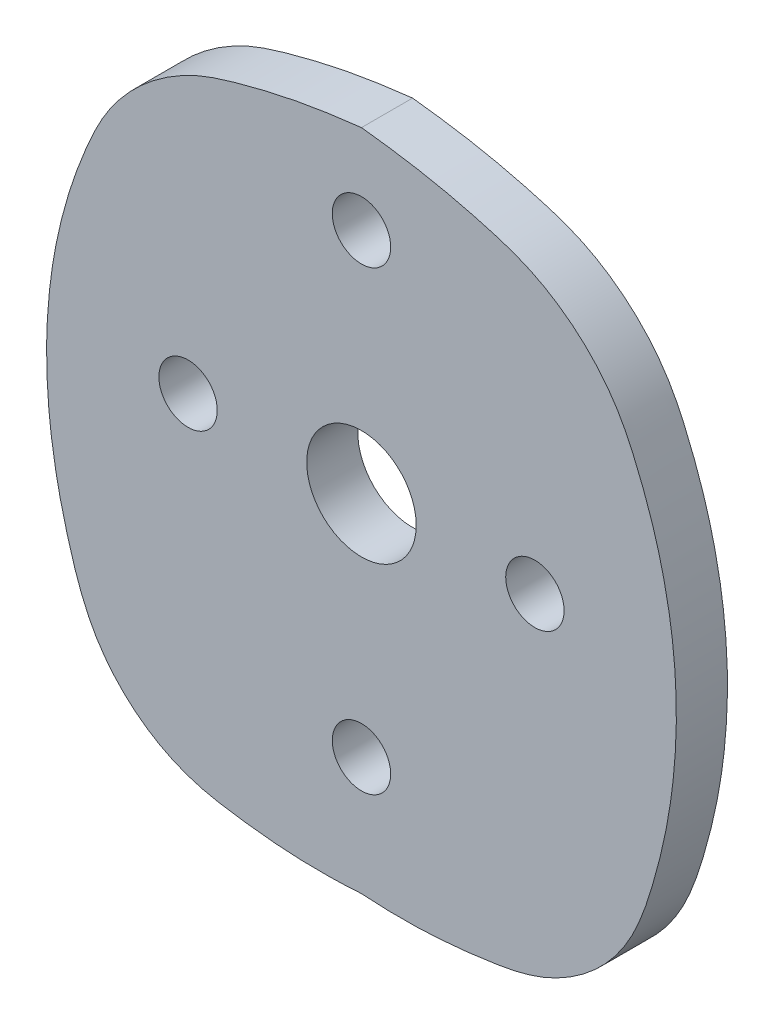
ISO-10303-21;
HEADER;
FILE_DESCRIPTION(('STEP AP214'),'2;1');
FILE_NAME('part.step','',(''),(''),'','','');
FILE_SCHEMA(('AUTOMOTIVE_DESIGN { 1 0 10303 214 1 1 1 1 }'));
ENDSEC;
DATA;
#1=APPLICATION_CONTEXT('core data for automotive mechanical design processes');
#2=APPLICATION_PROTOCOL_DEFINITION('international standard','automotive_design',2000,#1);
#3=PRODUCT_CONTEXT('',#1,'mechanical');
#4=PRODUCT('Part','Part','',(#3));
#5=PRODUCT_RELATED_PRODUCT_CATEGORY('part','',(#4));
#6=PRODUCT_DEFINITION_FORMATION('','',#4);
#7=PRODUCT_DEFINITION_CONTEXT('part definition',#1,'design');
#8=PRODUCT_DEFINITION('design','',#6,#7);
#9=PRODUCT_DEFINITION_SHAPE('','',#8);
#10=(LENGTH_UNIT() NAMED_UNIT(*) SI_UNIT(.MILLI.,.METRE.));
#11=(NAMED_UNIT(*) PLANE_ANGLE_UNIT() SI_UNIT($,.RADIAN.));
#12=(NAMED_UNIT(*) SI_UNIT($,.STERADIAN.) SOLID_ANGLE_UNIT());
#13=UNCERTAINTY_MEASURE_WITH_UNIT(LENGTH_MEASURE(1.E-05),#10,'distance_accuracy_value','');
#14=(GEOMETRIC_REPRESENTATION_CONTEXT(3) GLOBAL_UNCERTAINTY_ASSIGNED_CONTEXT((#13)) GLOBAL_UNIT_ASSIGNED_CONTEXT((#10,
#11,#12)) REPRESENTATION_CONTEXT('',''));
#15=CARTESIAN_POINT('',(0.,0.,0.));
#16=DIRECTION('',(0.,0.,1.));
#17=DIRECTION('',(1.,0.,0.));
#18=AXIS2_PLACEMENT_3D('',#15,#16,#17);
#19=CARTESIAN_POINT('',(17.2495468003958,102.153971763052,1.4));
#20=DIRECTION('',(0.,0.,-1.));
#21=DIRECTION('',(-1.,0.,0.));
#22=AXIS2_PLACEMENT_3D('',#19,#20,#21);
#23=PLANE('',#22);
#24=CARTESIAN_POINT('',(-0.00194851605084502,84.6627538818189,1.4));
#25=CARTESIAN_POINT('',(1.18640589704128,84.5749137239421,1.4));
#26=CARTESIAN_POINT('',(2.98152019668558,84.5534099120876,1.4));
#27=CARTESIAN_POINT('',(5.35288257603574,84.7299636902166,1.4));
#28=CARTESIAN_POINT('',(6.82893385604703,84.9200075591356,1.4));
#29=CARTESIAN_POINT('',(7.99248681931417,85.1043236099056,1.4));
#30=CARTESIAN_POINT('',(9.23385005522742,85.3782819656437,1.4));
#31=CARTESIAN_POINT('',(11.3097733927601,86.1719660445361,1.4));
#32=CARTESIAN_POINT('',(13.3512037583954,87.7914583641674,1.4));
#33=CARTESIAN_POINT('',(14.78394244169,89.883427402172,1.4));
#34=CARTESIAN_POINT('',(15.526120315298,91.6368959522322,1.4));
#35=CARTESIAN_POINT('',(16.0394099126427,93.3206564434219,1.4));
#36=CARTESIAN_POINT('',(16.6460931162424,95.6300295512059,1.4));
#37=CARTESIAN_POINT('',(17.1455982132386,98.5678877874798,1.4));
#38=CARTESIAN_POINT('',(17.3265839530986,102.154340228356,1.4));
#39=CARTESIAN_POINT('',(17.0453467767421,105.738581877409,1.4));
#40=CARTESIAN_POINT('',(16.4231764952126,108.669286983542,1.4));
#41=CARTESIAN_POINT('',(15.7006454750322,110.94782369539,1.4));
#42=CARTESIAN_POINT('',(15.1552395286702,112.341634893575,1.4));
#43=CARTESIAN_POINT('',(14.6797913683984,113.427246380424,1.4));
#44=CARTESIAN_POINT('',(14.1108342562074,114.550989632922,1.4));
#45=CARTESIAN_POINT('',(12.8669354376532,116.35778972915,1.4));
#46=CARTESIAN_POINT('',(10.9468766202507,118.02057598982,1.4));
#47=CARTESIAN_POINT('',(8.70699948376297,119.152590801809,1.4));
#48=CARTESIAN_POINT('',(6.94701455866536,119.693958367133,1.4));
#49=CARTESIAN_POINT('',(5.2464996036479,120.138050756151,1.4));
#50=CARTESIAN_POINT('',(2.92064138135333,120.635596611244,1.4));
#51=CARTESIAN_POINT('',(1.17271692036244,120.875374778235,1.4));
#52=CARTESIAN_POINT('',(0.00112271873752491,121.010798341713,1.4));
#53=B_SPLINE_CURVE_WITH_KNOTS('',3,(#24,#25,#26,#27,#28,#29,#30,#31,#32,#33,#34,#35,#36,#37,#38,
#39,#40,#41,#42,#43,#44,#45,#46,#47,#48,#49,#50,#51,#52),.UNSPECIFIED.,.F.,.F.,(4,1,1,1,1,1,1,1,
1,1,1,1,1,1,1,1,1,1,1,1,1,1,1,1,1,1,4),(0.0010272292882612,0.0635655807344601,
0.0948347564575595,0.126103932180659,0.141738520042209,0.157373107903758,0.188642283626858,
0.251180635073057,0.282449810796156,0.313718986519256,0.344988162242355,0.376257337965454,
0.438795689411653,0.501334040857852,0.563872392304051,0.62641074375025,0.657679919473349,
0.688949095196449,0.704583683057999,0.720218270919548,0.751487446642648,0.814025798088847,
0.845294973811946,0.876564149535046,0.907833325258145,0.939102500981244,1.00164085242744),.UNSPECIFIED.);
#54=CARTESIAN_POINT('',(-0.00194851605083319,84.6627538818189,1.4));
#55=VERTEX_POINT('',#54);
#56=CARTESIAN_POINT('',(0.0011227187375251,121.010798341713,1.4));
#57=VERTEX_POINT('',#56);
#58=EDGE_CURVE('E73',#55,#57,#53,.T.);
#59=ORIENTED_EDGE('',*,*,#58,.T.);
#60=CARTESIAN_POINT('',(0.0011227187375251,121.010798341713,1.4));
#61=CARTESIAN_POINT('',(-1.17153777696901,120.878564333721,1.4));
#62=CARTESIAN_POINT('',(-2.92034240422347,120.635017485104,1.4));
#63=CARTESIAN_POINT('',(-5.24701176742022,120.138030637647,1.4));
#64=CARTESIAN_POINT('',(-6.94680077778533,119.693821440425,1.4));
#65=CARTESIAN_POINT('',(-8.70696264764823,119.152836869126,1.4));
#66=CARTESIAN_POINT('',(-10.946545964471,118.020539751302,1.4));
#67=CARTESIAN_POINT('',(-12.8668523890684,116.358462008928,1.4));
#68=CARTESIAN_POINT('',(-14.1104086459571,114.550769630372,1.4));
#69=CARTESIAN_POINT('',(-14.6798152444744,113.42837489053,1.4));
#70=CARTESIAN_POINT('',(-15.1545274232197,112.342274586889,1.4));
#71=CARTESIAN_POINT('',(-15.7007644509968,110.948000199804,1.4));
#72=CARTESIAN_POINT('',(-16.4227487542122,108.670349077871,1.4));
#73=CARTESIAN_POINT('',(-17.0460210698812,105.737371486862,1.4));
#74=CARTESIAN_POINT('',(-17.3264438499529,102.153144608444,1.4));
#75=CARTESIAN_POINT('',(-17.1455231956016,98.5670999121692,1.4));
#76=CARTESIAN_POINT('',(-16.6459188181729,95.6288146406873,1.4));
#77=CARTESIAN_POINT('',(-16.0390610453862,93.3197973012248,1.4));
#78=CARTESIAN_POINT('',(-15.5260556995249,91.6348522616956,1.4));
#79=CARTESIAN_POINT('',(-14.783897478457,89.8838969199465,1.4));
#80=CARTESIAN_POINT('',(-13.3509693059527,87.7908871419973,1.4));
#81=CARTESIAN_POINT('',(-11.3097080928064,86.1718010951404,1.4));
#82=CARTESIAN_POINT('',(-9.233764019984,85.3784875101311,1.4));
#83=CARTESIAN_POINT('',(-7.99217371715951,85.1039743301671,1.4));
#84=CARTESIAN_POINT('',(-6.82932930794165,84.9202540614607,1.4));
#85=CARTESIAN_POINT('',(-5.35281001597741,84.7301081174426,1.4));
#86=CARTESIAN_POINT('',(-2.9810557449701,84.5521811799299,1.4));
#87=CARTESIAN_POINT('',(-1.18943239004468,84.5806981927112,1.4));
#88=CARTESIAN_POINT('',(-0.00194851605083319,84.6627538818189,1.4));
#89=B_SPLINE_CURVE_WITH_KNOTS('',3,(#60,#61,#62,#63,#64,#65,#66,#67,#68,#69,#70,#71,#72,#73,#74,
#75,#76,#77,#78,#79,#80,#81,#82,#83,#84,#85,#86,#87,#88),.UNSPECIFIED.,.F.,.F.,(4,1,1,1,1,1,1,1,
1,1,1,1,1,1,1,1,1,1,1,1,1,1,1,1,1,1,4),(-0.00164095537278689,0.0608973452480819,
0.0921664955585162,0.123435645868951,0.154704796179385,0.185973946489819,0.248512247110688,
0.279781397421122,0.29541597257634,0.311050547731557,0.342319698041991,0.373588848352426,
0.436127148973294,0.498665449594163,0.561203750215032,0.623742050835901,0.655011201146335,
0.686280351456769,0.717549501767204,0.748818652077638,0.811356952698507,0.842626103008941,
0.858260678164158,0.873895253319376,0.90516440362981,0.936433553940244,0.998971854561113),.UNSPECIFIED.);
#90=EDGE_CURVE('E57',#57,#55,#89,.T.);
#91=ORIENTED_EDGE('',*,*,#90,.T.);
#92=EDGE_LOOP('',(#59,#91));
#93=FACE_BOUND('',#92,.T.);
#94=CARTESIAN_POINT('',(0.,103.636945020621,1.4));
#95=DIRECTION('',(0.,0.,1.));
#96=DIRECTION('',(1.,0.,0.));
#97=AXIS2_PLACEMENT_3D('',#94,#95,#96);
#98=CIRCLE('',#97,3.);
#99=CARTESIAN_POINT('',(3.,103.636945020621,1.4));
#100=VERTEX_POINT('',#99);
#101=EDGE_CURVE('E81',#100,#100,#98,.T.);
#102=ORIENTED_EDGE('',*,*,#101,.F.);
#103=EDGE_LOOP('',(#102));
#104=FACE_BOUND('',#103,.T.);
#105=CARTESIAN_POINT('',(0.00133880573747101,116.136944948925,1.4));
#106=DIRECTION('',(0.,0.,1.));
#107=DIRECTION('',(1.,0.,0.));
#108=AXIS2_PLACEMENT_3D('',#105,#106,#107);
#109=CIRCLE('',#108,1.6);
#110=CARTESIAN_POINT('',(1.60133880573747,116.136944948925,1.4));
#111=VERTEX_POINT('',#110);
#112=EDGE_CURVE('E167',#111,#111,#109,.T.);
#113=ORIENTED_EDGE('',*,*,#112,.F.);
#114=EDGE_LOOP('',(#113));
#115=FACE_BOUND('',#114,.T.);
#116=CARTESIAN_POINT('',(-9.5,103.636945020621,1.4));
#117=DIRECTION('',(0.,0.,1.));
#118=DIRECTION('',(1.,0.,0.));
#119=AXIS2_PLACEMENT_3D('',#116,#117,#118);
#120=CIRCLE('',#119,1.6);
#121=CARTESIAN_POINT('',(-7.9,103.636945020621,1.4));
#122=VERTEX_POINT('',#121);
#123=EDGE_CURVE('E159',#122,#122,#120,.T.);
#124=ORIENTED_EDGE('',*,*,#123,.F.);
#125=EDGE_LOOP('',(#124));
#126=FACE_BOUND('',#125,.T.);
#127=CARTESIAN_POINT('',(0.00133880573747101,91.1369450923166,1.4));
#128=DIRECTION('',(0.,0.,1.));
#129=DIRECTION('',(-1.,0.,0.));
#130=AXIS2_PLACEMENT_3D('',#127,#128,#129);
#131=CIRCLE('',#130,1.6);
#132=CARTESIAN_POINT('',(-1.59866119426253,91.1369450923166,1.4));
#133=VERTEX_POINT('',#132);
#134=EDGE_CURVE('E151',#133,#133,#131,.T.);
#135=ORIENTED_EDGE('',*,*,#134,.F.);
#136=EDGE_LOOP('',(#135));
#137=FACE_BOUND('',#136,.T.);
#138=CARTESIAN_POINT('',(9.50267761147495,103.636945020621,1.4));
#139=DIRECTION('',(0.,0.,1.));
#140=DIRECTION('',(-1.,0.,0.));
#141=AXIS2_PLACEMENT_3D('',#138,#139,#140);
#142=CIRCLE('',#141,1.6);
#143=CARTESIAN_POINT('',(7.90267761147494,103.636945020621,1.4));
#144=VERTEX_POINT('',#143);
#145=EDGE_CURVE('E140',#144,#144,#142,.T.);
#146=ORIENTED_EDGE('',*,*,#145,.F.);
#147=EDGE_LOOP('',(#146));
#148=FACE_BOUND('',#147,.T.);
#149=ADVANCED_FACE('F39',(#93,#104,#115,#126,#137,#148),#23,.F.);
#150=CARTESIAN_POINT('',(17.2495468003958,102.153971763052,-1.4));
#151=DIRECTION('',(0.,0.,-1.));
#152=DIRECTION('',(-1.,0.,0.));
#153=AXIS2_PLACEMENT_3D('',#150,#151,#152);
#154=PLANE('',#153);
#155=CARTESIAN_POINT('',(0.00133880573747101,91.1369450923166,-1.4));
#156=DIRECTION('',(0.,0.,1.));
#157=DIRECTION('',(-1.,0.,0.));
#158=AXIS2_PLACEMENT_3D('',#155,#156,#157);
#159=CIRCLE('',#158,1.6);
#160=CARTESIAN_POINT('',(-1.59866119426253,91.1369450923166,-1.4));
#161=VERTEX_POINT('',#160);
#162=EDGE_CURVE('E148',#161,#161,#159,.T.);
#163=ORIENTED_EDGE('',*,*,#162,.T.);
#164=EDGE_LOOP('',(#163));
#165=FACE_BOUND('',#164,.T.);
#166=CARTESIAN_POINT('',(0.00133880573747101,116.136944948925,-1.4));
#167=DIRECTION('',(0.,0.,1.));
#168=DIRECTION('',(1.,0.,0.));
#169=AXIS2_PLACEMENT_3D('',#166,#167,#168);
#170=CIRCLE('',#169,1.6);
#171=CARTESIAN_POINT('',(1.60133880573747,116.136944948925,-1.4));
#172=VERTEX_POINT('',#171);
#173=EDGE_CURVE('E163',#172,#172,#170,.T.);
#174=ORIENTED_EDGE('',*,*,#173,.T.);
#175=EDGE_LOOP('',(#174));
#176=FACE_BOUND('',#175,.T.);
#177=CARTESIAN_POINT('',(-0.00194851605084502,84.6627538818189,-1.4));
#178=CARTESIAN_POINT('',(1.18640589704128,84.5749137239421,-1.4));
#179=CARTESIAN_POINT('',(2.98152019668558,84.5534099120876,-1.4));
#180=CARTESIAN_POINT('',(5.35288257603574,84.7299636902166,-1.4));
#181=CARTESIAN_POINT('',(6.82893385604703,84.9200075591356,-1.4));
#182=CARTESIAN_POINT('',(7.99248681931417,85.1043236099056,-1.4));
#183=CARTESIAN_POINT('',(9.23385005522742,85.3782819656437,-1.4));
#184=CARTESIAN_POINT('',(11.3097733927601,86.1719660445361,-1.4));
#185=CARTESIAN_POINT('',(13.3512037583954,87.7914583641674,-1.4));
#186=CARTESIAN_POINT('',(14.78394244169,89.883427402172,-1.4));
#187=CARTESIAN_POINT('',(15.526120315298,91.6368959522322,-1.4));
#188=CARTESIAN_POINT('',(16.0394099126427,93.3206564434219,-1.4));
#189=CARTESIAN_POINT('',(16.6460931162424,95.6300295512059,-1.4));
#190=CARTESIAN_POINT('',(17.1455982132386,98.5678877874798,-1.4));
#191=CARTESIAN_POINT('',(17.3265839530986,102.154340228356,-1.4));
#192=CARTESIAN_POINT('',(17.0453467767421,105.738581877409,-1.4));
#193=CARTESIAN_POINT('',(16.4231764952126,108.669286983542,-1.4));
#194=CARTESIAN_POINT('',(15.7006454750322,110.94782369539,-1.4));
#195=CARTESIAN_POINT('',(15.1552395286702,112.341634893575,-1.4));
#196=CARTESIAN_POINT('',(14.6797913683984,113.427246380424,-1.4));
#197=CARTESIAN_POINT('',(14.1108342562074,114.550989632922,-1.4));
#198=CARTESIAN_POINT('',(12.8669354376532,116.35778972915,-1.4));
#199=CARTESIAN_POINT('',(10.9468766202507,118.02057598982,-1.4));
#200=CARTESIAN_POINT('',(8.70699948376297,119.152590801809,-1.4));
#201=CARTESIAN_POINT('',(6.94701455866536,119.693958367133,-1.4));
#202=CARTESIAN_POINT('',(5.2464996036479,120.138050756151,-1.4));
#203=CARTESIAN_POINT('',(2.92064138135333,120.635596611244,-1.4));
#204=CARTESIAN_POINT('',(1.17271692036244,120.875374778235,-1.4));
#205=CARTESIAN_POINT('',(0.00112271873752491,121.010798341713,-1.4));
#206=B_SPLINE_CURVE_WITH_KNOTS('',3,(#177,#178,#179,#180,#181,#182,#183,#184,#185,#186,#187,
#188,#189,#190,#191,#192,#193,#194,#195,#196,#197,#198,#199,#200,#201,#202,#203,#204,#205),
.UNSPECIFIED.,.F.,.F.,(4,1,1,1,1,1,1,1,1,1,1,1,1,1,1,1,1,1,1,1,1,1,1,1,1,1,4),
(0.0010272292882612,0.0635655807344601,0.0948347564575595,0.126103932180659,0.141738520042209,
0.157373107903758,0.188642283626858,0.251180635073057,0.282449810796156,0.313718986519256,
0.344988162242355,0.376257337965454,0.438795689411653,0.501334040857852,0.563872392304051,
0.62641074375025,0.657679919473349,0.688949095196449,0.704583683057999,0.720218270919548,
0.751487446642648,0.814025798088847,0.845294973811946,0.876564149535046,0.907833325258145,
0.939102500981244,1.00164085242744),.UNSPECIFIED.);
#207=CARTESIAN_POINT('',(-0.00194851605083319,84.6627538818189,-1.4));
#208=VERTEX_POINT('',#207);
#209=CARTESIAN_POINT('',(0.0011227187375251,121.010798341713,-1.4));
#210=VERTEX_POINT('',#209);
#211=EDGE_CURVE('E74',#208,#210,#206,.T.);
#212=ORIENTED_EDGE('',*,*,#211,.F.);
#213=CARTESIAN_POINT('',(0.0011227187375251,121.010798341713,-1.4));
#214=CARTESIAN_POINT('',(-1.17153777696901,120.878564333721,-1.4));
#215=CARTESIAN_POINT('',(-2.92034240422347,120.635017485104,-1.4));
#216=CARTESIAN_POINT('',(-5.24701176742022,120.138030637647,-1.4));
#217=CARTESIAN_POINT('',(-6.94680077778533,119.693821440425,-1.4));
#218=CARTESIAN_POINT('',(-8.70696264764823,119.152836869126,-1.4));
#219=CARTESIAN_POINT('',(-10.946545964471,118.020539751302,-1.4));
#220=CARTESIAN_POINT('',(-12.8668523890684,116.358462008928,-1.4));
#221=CARTESIAN_POINT('',(-14.1104086459571,114.550769630372,-1.4));
#222=CARTESIAN_POINT('',(-14.6798152444744,113.42837489053,-1.4));
#223=CARTESIAN_POINT('',(-15.1545274232197,112.342274586889,-1.4));
#224=CARTESIAN_POINT('',(-15.7007644509968,110.948000199804,-1.4));
#225=CARTESIAN_POINT('',(-16.4227487542122,108.670349077871,-1.4));
#226=CARTESIAN_POINT('',(-17.0460210698812,105.737371486862,-1.4));
#227=CARTESIAN_POINT('',(-17.3264438499529,102.153144608444,-1.4));
#228=CARTESIAN_POINT('',(-17.1455231956016,98.5670999121692,-1.4));
#229=CARTESIAN_POINT('',(-16.6459188181729,95.6288146406873,-1.4));
#230=CARTESIAN_POINT('',(-16.0390610453862,93.3197973012248,-1.4));
#231=CARTESIAN_POINT('',(-15.5260556995249,91.6348522616956,-1.4));
#232=CARTESIAN_POINT('',(-14.783897478457,89.8838969199465,-1.4));
#233=CARTESIAN_POINT('',(-13.3509693059527,87.7908871419973,-1.4));
#234=CARTESIAN_POINT('',(-11.3097080928064,86.1718010951404,-1.4));
#235=CARTESIAN_POINT('',(-9.233764019984,85.3784875101311,-1.4));
#236=CARTESIAN_POINT('',(-7.99217371715951,85.1039743301671,-1.4));
#237=CARTESIAN_POINT('',(-6.82932930794165,84.9202540614607,-1.4));
#238=CARTESIAN_POINT('',(-5.35281001597741,84.7301081174426,-1.4));
#239=CARTESIAN_POINT('',(-2.9810557449701,84.5521811799299,-1.4));
#240=CARTESIAN_POINT('',(-1.18943239004468,84.5806981927112,-1.4));
#241=CARTESIAN_POINT('',(-0.00194851605083319,84.6627538818189,-1.4));
#242=B_SPLINE_CURVE_WITH_KNOTS('',3,(#213,#214,#215,#216,#217,#218,#219,#220,#221,#222,#223,
#224,#225,#226,#227,#228,#229,#230,#231,#232,#233,#234,#235,#236,#237,#238,#239,#240,#241),
.UNSPECIFIED.,.F.,.F.,(4,1,1,1,1,1,1,1,1,1,1,1,1,1,1,1,1,1,1,1,1,1,1,1,1,1,4),
(-0.00164095537278689,0.0608973452480819,0.0921664955585162,0.123435645868951,0.154704796179385,
0.185973946489819,0.248512247110688,0.279781397421122,0.29541597257634,0.311050547731557,
0.342319698041991,0.373588848352426,0.436127148973294,0.498665449594163,0.561203750215032,
0.623742050835901,0.655011201146335,0.686280351456769,0.717549501767204,0.748818652077638,
0.811356952698507,0.842626103008941,0.858260678164158,0.873895253319376,0.90516440362981,
0.936433553940244,0.998971854561113),.UNSPECIFIED.);
#243=EDGE_CURVE('E65',#210,#208,#242,.T.);
#244=ORIENTED_EDGE('',*,*,#243,.F.);
#245=EDGE_LOOP('',(#212,#244));
#246=FACE_BOUND('',#245,.T.);
#247=CARTESIAN_POINT('',(0.,103.636945020621,-1.4));
#248=DIRECTION('',(0.,0.,1.));
#249=DIRECTION('',(1.,0.,0.));
#250=AXIS2_PLACEMENT_3D('',#247,#248,#249);
#251=CIRCLE('',#250,3.);
#252=CARTESIAN_POINT('',(3.,103.636945020621,-1.4));
#253=VERTEX_POINT('',#252);
#254=EDGE_CURVE('E85',#253,#253,#251,.T.);
#255=ORIENTED_EDGE('',*,*,#254,.T.);
#256=EDGE_LOOP('',(#255));
#257=FACE_BOUND('',#256,.T.);
#258=CARTESIAN_POINT('',(-9.5,103.636945020621,-1.4));
#259=DIRECTION('',(0.,0.,1.));
#260=DIRECTION('',(1.,0.,0.));
#261=AXIS2_PLACEMENT_3D('',#258,#259,#260);
#262=CIRCLE('',#261,1.6);
#263=CARTESIAN_POINT('',(-7.9,103.636945020621,-1.4));
#264=VERTEX_POINT('',#263);
#265=EDGE_CURVE('E155',#264,#264,#262,.T.);
#266=ORIENTED_EDGE('',*,*,#265,.T.);
#267=EDGE_LOOP('',(#266));
#268=FACE_BOUND('',#267,.T.);
#269=CARTESIAN_POINT('',(9.50267761147495,103.636945020621,-1.4));
#270=DIRECTION('',(0.,0.,1.));
#271=DIRECTION('',(-1.,0.,0.));
#272=AXIS2_PLACEMENT_3D('',#269,#270,#271);
#273=CIRCLE('',#272,1.6);
#274=CARTESIAN_POINT('',(7.90267761147494,103.636945020621,-1.4));
#275=VERTEX_POINT('',#274);
#276=EDGE_CURVE('E143',#275,#275,#273,.T.);
#277=ORIENTED_EDGE('',*,*,#276,.T.);
#278=EDGE_LOOP('',(#277));
#279=FACE_BOUND('',#278,.T.);
#280=ADVANCED_FACE('F78',(#165,#176,#246,#257,#268,#279),#154,.T.);
#281=DIRECTION('',(0.,0.,-1.));
#282=VECTOR('',#281,1.);
#283=SURFACE_OF_LINEAR_EXTRUSION('',#53,#282);
#284=ORIENTED_EDGE('',*,*,#211,.T.);
#285=DIRECTION('',(0.,0.,-1.));
#286=VECTOR('',#285,1.);
#287=CARTESIAN_POINT('',(0.0011227187375251,121.010798341713,1.4));
#288=LINE('',#287,#286);
#289=EDGE_CURVE('E11',#57,#210,#288,.T.);
#290=ORIENTED_EDGE('',*,*,#289,.F.);
#291=ORIENTED_EDGE('',*,*,#58,.F.);
#292=DIRECTION('',(0.,0.,-1.));
#293=VECTOR('',#292,1.);
#294=CARTESIAN_POINT('',(-0.00194851605083319,84.6627538818189,1.4));
#295=LINE('',#294,#293);
#296=EDGE_CURVE('E50',#55,#208,#295,.T.);
#297=ORIENTED_EDGE('',*,*,#296,.T.);
#298=EDGE_LOOP('',(#284,#290,#291,#297));
#299=FACE_BOUND('',#298,.T.);
#300=ADVANCED_FACE('F41',(#299),#283,.F.);
#301=DIRECTION('',(0.,0.,-1.));
#302=VECTOR('',#301,1.);
#303=SURFACE_OF_LINEAR_EXTRUSION('',#89,#302);
#304=ORIENTED_EDGE('',*,*,#243,.T.);
#305=ORIENTED_EDGE('',*,*,#296,.F.);
#306=ORIENTED_EDGE('',*,*,#90,.F.);
#307=ORIENTED_EDGE('',*,*,#289,.T.);
#308=EDGE_LOOP('',(#304,#305,#306,#307));
#309=FACE_BOUND('',#308,.T.);
#310=ADVANCED_FACE('F68',(#309),#303,.F.);
#311=CARTESIAN_POINT('',(0.,103.636945020621,1.4));
#312=DIRECTION('',(0.,0.,-1.));
#313=DIRECTION('',(-1.,0.,0.));
#314=AXIS2_PLACEMENT_3D('',#311,#312,#313);
#315=CYLINDRICAL_SURFACE('',#314,3.);
#316=ORIENTED_EDGE('',*,*,#101,.T.);
#317=EDGE_LOOP('',(#316));
#318=FACE_BOUND('',#317,.T.);
#319=ORIENTED_EDGE('',*,*,#254,.F.);
#320=EDGE_LOOP('',(#319));
#321=FACE_BOUND('',#320,.T.);
#322=ADVANCED_FACE('F111',(#318,#321),#315,.F.);
#323=CARTESIAN_POINT('',(0.00133880573747101,116.136944948925,1.4));
#324=DIRECTION('',(0.,0.,-1.));
#325=DIRECTION('',(-1.,0.,0.));
#326=AXIS2_PLACEMENT_3D('',#323,#324,#325);
#327=CYLINDRICAL_SURFACE('',#326,1.6);
#328=ORIENTED_EDGE('',*,*,#112,.T.);
#329=EDGE_LOOP('',(#328));
#330=FACE_BOUND('',#329,.T.);
#331=ORIENTED_EDGE('',*,*,#173,.F.);
#332=EDGE_LOOP('',(#331));
#333=FACE_BOUND('',#332,.T.);
#334=ADVANCED_FACE('F119',(#330,#333),#327,.F.);
#335=CARTESIAN_POINT('',(-9.5,103.636945020621,1.4));
#336=DIRECTION('',(0.,0.,-1.));
#337=DIRECTION('',(-1.,0.,0.));
#338=AXIS2_PLACEMENT_3D('',#335,#336,#337);
#339=CYLINDRICAL_SURFACE('',#338,1.6);
#340=ORIENTED_EDGE('',*,*,#123,.T.);
#341=EDGE_LOOP('',(#340));
#342=FACE_BOUND('',#341,.T.);
#343=ORIENTED_EDGE('',*,*,#265,.F.);
#344=EDGE_LOOP('',(#343));
#345=FACE_BOUND('',#344,.T.);
#346=ADVANCED_FACE('F123',(#342,#345),#339,.F.);
#347=CARTESIAN_POINT('',(0.00133880573747101,91.1369450923166,1.4));
#348=DIRECTION('',(0.,0.,-1.));
#349=DIRECTION('',(-1.,0.,0.));
#350=AXIS2_PLACEMENT_3D('',#347,#348,#349);
#351=CYLINDRICAL_SURFACE('',#350,1.6);
#352=ORIENTED_EDGE('',*,*,#134,.T.);
#353=EDGE_LOOP('',(#352));
#354=FACE_BOUND('',#353,.T.);
#355=ORIENTED_EDGE('',*,*,#162,.F.);
#356=EDGE_LOOP('',(#355));
#357=FACE_BOUND('',#356,.T.);
#358=ADVANCED_FACE('F127',(#354,#357),#351,.F.);
#359=CARTESIAN_POINT('',(9.50267761147495,103.636945020621,1.4));
#360=DIRECTION('',(0.,0.,-1.));
#361=DIRECTION('',(-1.,0.,0.));
#362=AXIS2_PLACEMENT_3D('',#359,#360,#361);
#363=CYLINDRICAL_SURFACE('',#362,1.6);
#364=ORIENTED_EDGE('',*,*,#145,.T.);
#365=EDGE_LOOP('',(#364));
#366=FACE_BOUND('',#365,.T.);
#367=ORIENTED_EDGE('',*,*,#276,.F.);
#368=EDGE_LOOP('',(#367));
#369=FACE_BOUND('',#368,.T.);
#370=ADVANCED_FACE('F131',(#366,#369),#363,.F.);
#371=CLOSED_SHELL('',(#149,#280,#300,#310,#322,#334,#346,#358,#370));
#372=MANIFOLD_SOLID_BREP('B2',#371);
#373=ADVANCED_BREP_SHAPE_REPRESENTATION('',(#18,#372),#14);
#374=SHAPE_DEFINITION_REPRESENTATION(#9,#373);
ENDSEC;
END-ISO-10303-21;
